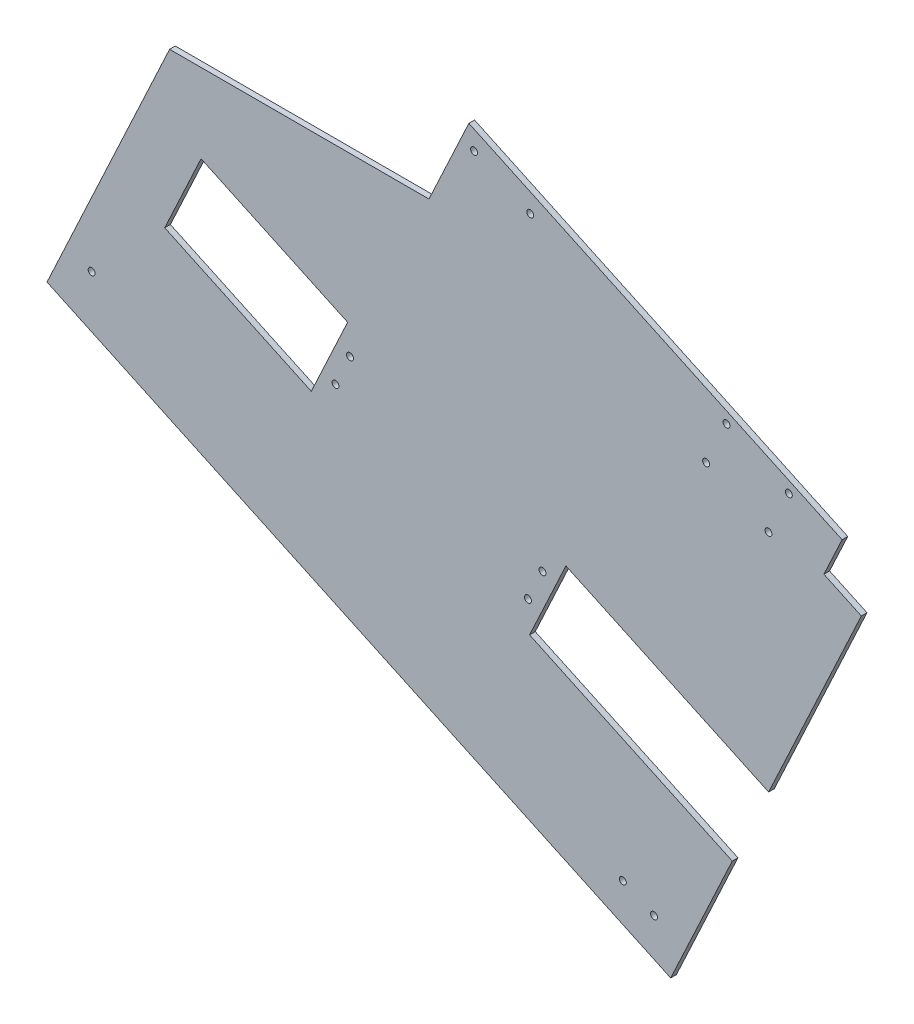
ISO-10303-21;
HEADER;
FILE_DESCRIPTION(('STEP AP214'),'2;1');
FILE_NAME('part.step','',(''),(''),'','','');
FILE_SCHEMA(('AUTOMOTIVE_DESIGN { 1 0 10303 214 1 1 1 1 }'));
ENDSEC;
DATA;
#1=APPLICATION_CONTEXT('core data for automotive mechanical design processes');
#2=APPLICATION_PROTOCOL_DEFINITION('international standard','automotive_design',2000,#1);
#3=PRODUCT_CONTEXT('',#1,'mechanical');
#4=PRODUCT('Part','Part','',(#3));
#5=PRODUCT_RELATED_PRODUCT_CATEGORY('part','',(#4));
#6=PRODUCT_DEFINITION_FORMATION('','',#4);
#7=PRODUCT_DEFINITION_CONTEXT('part definition',#1,'design');
#8=PRODUCT_DEFINITION('design','',#6,#7);
#9=PRODUCT_DEFINITION_SHAPE('','',#8);
#10=(LENGTH_UNIT() NAMED_UNIT(*) SI_UNIT(.MILLI.,.METRE.));
#11=(NAMED_UNIT(*) PLANE_ANGLE_UNIT() SI_UNIT($,.RADIAN.));
#12=(NAMED_UNIT(*) SI_UNIT($,.STERADIAN.) SOLID_ANGLE_UNIT());
#13=UNCERTAINTY_MEASURE_WITH_UNIT(LENGTH_MEASURE(1.E-05),#10,'distance_accuracy_value','');
#14=(GEOMETRIC_REPRESENTATION_CONTEXT(3) GLOBAL_UNCERTAINTY_ASSIGNED_CONTEXT((#13)) GLOBAL_UNIT_ASSIGNED_CONTEXT((#10,
#11,#12)) REPRESENTATION_CONTEXT('',''));
#15=CARTESIAN_POINT('',(0.,0.,0.));
#16=DIRECTION('',(0.,0.,1.));
#17=DIRECTION('',(1.,0.,0.));
#18=AXIS2_PLACEMENT_3D('',#15,#16,#17);
#19=CARTESIAN_POINT('',(140.969047692371,-84.2343516858792,605.067916458401));
#20=DIRECTION('',(-0.906307787036651,0.422618261740697,0.));
#21=DIRECTION('',(-0.422618261740697,-0.906307787036651,0.));
#22=AXIS2_PLACEMENT_3D('',#19,#20,#21);
#23=PLANE('',#22);
#24=DIRECTION('',(0.422618261740697,0.906307787036651,0.));
#25=VECTOR('',#24,1.);
#26=CARTESIAN_POINT('',(140.969047692371,-84.2343516858792,0.));
#27=LINE('',#26,#25);
#28=CARTESIAN_POINT('',(30.1585394639596,-321.86825344689,0.));
#29=VERTEX_POINT('',#28);
#30=CARTESIAN_POINT('',(65.9543062333968,-245.103983884885,0.));
#31=VERTEX_POINT('',#30);
#32=EDGE_CURVE('E232',#29,#31,#27,.T.);
#33=ORIENTED_EDGE('',*,*,#32,.T.);
#34=DIRECTION('',(0.,0.,1.));
#35=VECTOR('',#34,1.);
#36=CARTESIAN_POINT('',(65.9543062333968,-245.103983884885,-6.69999999999985));
#37=LINE('',#36,#35);
#38=CARTESIAN_POINT('',(65.9543062333968,-245.103983884885,3.30000000000015));
#39=VERTEX_POINT('',#38);
#40=EDGE_CURVE('E191',#31,#39,#37,.T.);
#41=ORIENTED_EDGE('',*,*,#40,.T.);
#42=DIRECTION('',(-0.422618261740697,-0.906307787036651,0.));
#43=VECTOR('',#42,1.);
#44=CARTESIAN_POINT('',(140.969047692371,-84.2343516858792,3.3000000000003));
#45=LINE('',#44,#43);
#46=CARTESIAN_POINT('',(30.1585394639596,-321.86825344689,3.30000000000031));
#47=VERTEX_POINT('',#46);
#48=EDGE_CURVE('E240',#39,#47,#45,.T.);
#49=ORIENTED_EDGE('',*,*,#48,.T.);
#50=DIRECTION('',(0.,0.,-1.));
#51=VECTOR('',#50,1.);
#52=CARTESIAN_POINT('',(30.1585394639596,-321.86825344689,605.067916458401));
#53=LINE('',#52,#51);
#54=EDGE_CURVE('E281',#47,#29,#53,.T.);
#55=ORIENTED_EDGE('',*,*,#54,.T.);
#56=EDGE_LOOP('',(#33,#41,#49,#55));
#57=FACE_BOUND('',#56,.T.);
#58=ADVANCED_FACE('F33',(#57),#23,.F.);
#59=CARTESIAN_POINT('',(0.,0.,0.));
#60=DIRECTION('',(0.,0.,-1.));
#61=DIRECTION('',(-1.,0.,0.));
#62=AXIS2_PLACEMENT_3D('',#59,#60,#61);
#63=PLANE('',#62);
#64=CARTESIAN_POINT('',(-52.7985285996815,-172.57110093474,0.));
#65=DIRECTION('',(0.,0.,-1.));
#66=DIRECTION('',(-1.,0.,0.));
#67=AXIS2_PLACEMENT_3D('',#64,#65,#66);
#68=CIRCLE('',#67,2.);
#69=CARTESIAN_POINT('',(-54.7985285996815,-172.57110093474,0.));
#70=VERTEX_POINT('',#69);
#71=EDGE_CURVE('E514',#70,#70,#68,.T.);
#72=ORIENTED_EDGE('',*,*,#71,.F.);
#73=EDGE_LOOP('',(#72));
#74=FACE_BOUND('',#73,.T.);
#75=CARTESIAN_POINT('',(-44.3461633648675,-154.444945194007,0.));
#76=DIRECTION('',(0.,0.,-1.));
#77=DIRECTION('',(-1.,0.,0.));
#78=AXIS2_PLACEMENT_3D('',#75,#76,#77);
#79=CIRCLE('',#78,2.);
#80=CARTESIAN_POINT('',(-46.3461633648675,-154.444945194007,0.));
#81=VERTEX_POINT('',#80);
#82=EDGE_CURVE('E511',#81,#81,#79,.T.);
#83=ORIENTED_EDGE('',*,*,#82,.F.);
#84=EDGE_LOOP('',(#83));
#85=FACE_BOUND('',#84,.T.);
#86=CARTESIAN_POINT('',(-164.672545808052,-120.403389961913,0.));
#87=DIRECTION('',(0.,0.,-1.));
#88=DIRECTION('',(-1.,0.,0.));
#89=AXIS2_PLACEMENT_3D('',#86,#87,#88);
#90=CIRCLE('',#89,1.99999999999997);
#91=CARTESIAN_POINT('',(-166.672545808052,-120.403389961913,0.));
#92=VERTEX_POINT('',#91);
#93=EDGE_CURVE('E508',#92,#92,#90,.T.);
#94=ORIENTED_EDGE('',*,*,#93,.F.);
#95=EDGE_LOOP('',(#94));
#96=FACE_BOUND('',#95,.T.);
#97=CARTESIAN_POINT('',(-156.220180573238,-102.27723422118,0.));
#98=DIRECTION('',(0.,0.,-1.));
#99=DIRECTION('',(-1.,0.,0.));
#100=AXIS2_PLACEMENT_3D('',#97,#98,#99);
#101=CIRCLE('',#100,2.);
#102=CARTESIAN_POINT('',(-158.220180573238,-102.27723422118,0.));
#103=VERTEX_POINT('',#102);
#104=EDGE_CURVE('E505',#103,#103,#101,.T.);
#105=ORIENTED_EDGE('',*,*,#104,.F.);
#106=EDGE_LOOP('',(#105));
#107=FACE_BOUND('',#106,.T.);
#108=DIRECTION('',(-0.906307787036651,0.422618261740697,0.));
#109=VECTOR('',#108,1.);
#110=CARTESIAN_POINT('',(-82.1004247301206,-176.064929010519,0.));
#111=LINE('',#110,#109);
#112=CARTESIAN_POINT('',(-178.748796266499,-130.997053214897,0.));
#113=VERTEX_POINT('',#112);
#114=CARTESIAN_POINT('',(-263.941728247944,-91.2709366112713,0.));
#115=VERTEX_POINT('',#114);
#116=EDGE_CURVE('E180',#113,#115,#111,.T.);
#117=ORIENTED_EDGE('',*,*,#116,.F.);
#118=DIRECTION('',(-0.422618261740696,-0.906307787036651,0.));
#119=VECTOR('',#118,1.);
#120=CARTESIAN_POINT('',(-96.6483715363787,45.0678757956226,0.));
#121=LINE('',#120,#119);
#122=CARTESIAN_POINT('',(-157.617883179464,-85.6816638630641,0.));
#123=VERTEX_POINT('',#122);
#124=EDGE_CURVE('E173',#123,#113,#121,.T.);
#125=ORIENTED_EDGE('',*,*,#124,.F.);
#126=DIRECTION('',(0.906307787036651,-0.422618261740696,0.));
#127=VECTOR('',#126,1.);
#128=CARTESIAN_POINT('',(-60.9695116430858,-130.749539658687,0.));
#129=LINE('',#128,#127);
#130=CARTESIAN_POINT('',(-242.810815160909,-45.9555472594389,0.));
#131=VERTEX_POINT('',#130);
#132=EDGE_CURVE('E154',#131,#123,#129,.T.);
#133=ORIENTED_EDGE('',*,*,#132,.F.);
#134=DIRECTION('',(0.422618261740697,0.906307787036651,0.));
#135=VECTOR('',#134,1.);
#136=CARTESIAN_POINT('',(-181.841303517823,84.7939923992478,0.));
#137=LINE('',#136,#135);
#138=EDGE_CURVE('E178',#115,#131,#137,.T.);
#139=ORIENTED_EDGE('',*,*,#138,.F.);
#140=EDGE_LOOP('',(#117,#125,#133,#139));
#141=FACE_BOUND('',#140,.T.);
#142=DIRECTION('',(-0.906307787036651,0.422618261740697,0.));
#143=VECTOR('',#142,1.);
#144=CARTESIAN_POINT('',(-82.1004247301206,-176.064929010519,0.));
#145=LINE('',#144,#143);
#146=CARTESIAN_POINT('',(-51.8657060813679,-190.163609858594,0.));
#147=VERTEX_POINT('',#146);
#148=EDGE_CURVE('E203',#31,#147,#145,.T.);
#149=ORIENTED_EDGE('',*,*,#148,.F.);
#150=ORIENTED_EDGE('',*,*,#32,.F.);
#151=DIRECTION('',(0.906307787036651,-0.422618261740697,0.));
#152=VECTOR('',#151,1.);
#153=CARTESIAN_POINT('',(30.1585394639596,-321.86825344689,0.));
#154=LINE('',#153,#152);
#155=CARTESIAN_POINT('',(-332.364575350701,-152.820948750611,0.));
#156=VERTEX_POINT('',#155);
#157=EDGE_CURVE('E237',#156,#29,#154,.T.);
#158=ORIENTED_EDGE('',*,*,#157,.F.);
#159=DIRECTION('',(-0.422618261740698,-0.906307787036651,0.));
#160=VECTOR('',#159,1.);
#161=CARTESIAN_POINT('',(-332.364575350701,-152.820948750611,0.));
#162=LINE('',#161,#160);
#163=CARTESIAN_POINT('',(-261.101380083713,0.00346667706951484,0.));
#164=VERTEX_POINT('',#163);
#165=EDGE_CURVE('E242',#164,#156,#162,.T.);
#166=ORIENTED_EDGE('',*,*,#165,.F.);
#167=DIRECTION('',(-1.,0.,0.));
#168=VECTOR('',#167,1.);
#169=CARTESIAN_POINT('',(-261.101380083713,0.00346667706951484,0.));
#170=LINE('',#169,#168);
#171=CARTESIAN_POINT('',(-110.332441908566,0.00346667706951484,0.));
#172=VERTEX_POINT('',#171);
#173=EDGE_CURVE('E247',#172,#164,#170,.T.);
#174=ORIENTED_EDGE('',*,*,#173,.F.);
#175=DIRECTION('',(-0.422618261740696,-0.906307787036651,0.));
#176=VECTOR('',#175,1.);
#177=CARTESIAN_POINT('',(-110.332441908566,0.00346667706951484,0.));
#178=LINE('',#177,#176);
#179=CARTESIAN_POINT('',(-87.1479387989079,49.7227940443066,0.));
#180=VERTEX_POINT('',#179);
#181=EDGE_CURVE('E252',#180,#172,#178,.T.);
#182=ORIENTED_EDGE('',*,*,#181,.F.);
#183=DIRECTION('',(-0.906307787036651,0.422618261740696,0.));
#184=VECTOR('',#183,1.);
#185=CARTESIAN_POINT('',(-87.1479387989079,49.7227940443066,0.));
#186=LINE('',#185,#184);
#187=CARTESIAN_POINT('',(129.783117347009,-51.4338187281854,0.));
#188=VERTEX_POINT('',#187);
#189=EDGE_CURVE('E218',#188,#180,#186,.T.);
#190=ORIENTED_EDGE('',*,*,#189,.F.);
#191=DIRECTION('',(0.422618261740695,0.906307787036652,0.));
#192=VECTOR('',#191,1.);
#193=CARTESIAN_POINT('',(129.783117347009,-51.4338187281854,0.));
#194=LINE('',#193,#192);
#195=CARTESIAN_POINT('',(119.217660803491,-74.0915134041025,0.));
#196=VERTEX_POINT('',#195);
#197=EDGE_CURVE('E222',#196,#188,#194,.T.);
#198=ORIENTED_EDGE('',*,*,#197,.F.);
#199=DIRECTION('',(-0.906307787036651,0.422618261740697,0.));
#200=VECTOR('',#199,1.);
#201=CARTESIAN_POINT('',(119.217660803491,-74.0915134041025,0.));
#202=LINE('',#201,#200);
#203=CARTESIAN_POINT('',(140.969047692371,-84.2343516858792,0.));
#204=VERTEX_POINT('',#203);
#205=EDGE_CURVE('E227',#204,#196,#202,.T.);
#206=ORIENTED_EDGE('',*,*,#205,.F.);
#207=CARTESIAN_POINT('',(87.0852193204317,-199.788594533052,0.));
#208=VERTEX_POINT('',#207);
#209=EDGE_CURVE('E236',#208,#204,#27,.T.);
#210=ORIENTED_EDGE('',*,*,#209,.F.);
#211=DIRECTION('',(0.906307787036652,-0.422618261740696,0.));
#212=VECTOR('',#211,1.);
#213=CARTESIAN_POINT('',(-60.9695116430857,-130.749539658687,0.));
#214=LINE('',#213,#212);
#215=CARTESIAN_POINT('',(-30.7347929943331,-144.848220506762,0.));
#216=VERTEX_POINT('',#215);
#217=EDGE_CURVE('E194',#216,#208,#214,.T.);
#218=ORIENTED_EDGE('',*,*,#217,.F.);
#219=DIRECTION('',(0.422618261740696,0.906307787036652,0.));
#220=VECTOR('',#219,1.);
#221=CARTESIAN_POINT('',(30.2347186487526,-14.098680848075,0.));
#222=LINE('',#221,#220);
#223=EDGE_CURVE('E201',#147,#216,#222,.T.);
#224=ORIENTED_EDGE('',*,*,#223,.F.);
#225=EDGE_LOOP('',(#149,#150,#158,#166,#174,#182,#190,#198,#206,#210,#218,#224));
#226=FACE_BOUND('',#225,.T.);
#227=CARTESIAN_POINT('',(-51.4965787867016,22.0645126573495,0.));
#228=DIRECTION('',(0.,0.,-1.));
#229=DIRECTION('',(-1.,0.,0.));
#230=AXIS2_PLACEMENT_3D('',#227,#228,#229);
#231=CIRCLE('',#230,2.);
#232=CARTESIAN_POINT('',(-53.4965787867016,22.0645126573495,0.));
#233=VERTEX_POINT('',#232);
#234=EDGE_CURVE('E210',#233,#233,#231,.T.);
#235=ORIENTED_EDGE('',*,*,#234,.F.);
#236=EDGE_LOOP('',(#235));
#237=FACE_BOUND('',#236,.T.);
#238=CARTESIAN_POINT('',(-84.123659120021,37.2787700800146,0.));
#239=DIRECTION('',(0.,0.,-1.));
#240=DIRECTION('',(-1.,0.,0.));
#241=AXIS2_PLACEMENT_3D('',#238,#239,#240);
#242=CIRCLE('',#241,2.00000000000001);
#243=CARTESIAN_POINT('',(-86.1236591200211,37.2787700800146,0.));
#244=VERTEX_POINT('',#243);
#245=EDGE_CURVE('E205',#244,#244,#242,.T.);
#246=ORIENTED_EDGE('',*,*,#245,.F.);
#247=EDGE_LOOP('',(#246));
#248=FACE_BOUND('',#247,.T.);
#249=CARTESIAN_POINT('',(2.35859321730739,-286.837367236529,0.));
#250=DIRECTION('',(0.,0.,1.));
#251=DIRECTION('',(1.,0.,0.));
#252=AXIS2_PLACEMENT_3D('',#249,#250,#251);
#253=CIRCLE('',#252,2.);
#254=CARTESIAN_POINT('',(4.35859321730739,-286.837367236529,0.));
#255=VERTEX_POINT('',#254);
#256=EDGE_CURVE('E209',#255,#255,#253,.T.);
#257=ORIENTED_EDGE('',*,*,#256,.T.);
#258=EDGE_LOOP('',(#257));
#259=FACE_BOUND('',#258,.T.);
#260=CARTESIAN_POINT('',(50.7512369685833,-52.0954969140643,0.));
#261=DIRECTION('',(0.,0.,1.));
#262=DIRECTION('',(1.,0.,0.));
#263=AXIS2_PLACEMENT_3D('',#260,#261,#262);
#264=CIRCLE('',#263,2.);
#265=CARTESIAN_POINT('',(52.7512369685833,-52.0954969140643,0.));
#266=VERTEX_POINT('',#265);
#267=EDGE_CURVE('E264',#266,#266,#264,.T.);
#268=ORIENTED_EDGE('',*,*,#267,.T.);
#269=EDGE_LOOP('',(#268));
#270=FACE_BOUND('',#269,.T.);
#271=CARTESIAN_POINT('',(98.8368597787888,-43.623609346666,0.));
#272=DIRECTION('',(0.,0.,1.));
#273=DIRECTION('',(1.,0.,0.));
#274=AXIS2_PLACEMENT_3D('',#271,#272,#273);
#275=CIRCLE('',#274,2.);
#276=CARTESIAN_POINT('',(100.836859778789,-43.623609346666,0.));
#277=VERTEX_POINT('',#276);
#278=EDGE_CURVE('E261',#277,#277,#275,.T.);
#279=ORIENTED_EDGE('',*,*,#278,.T.);
#280=EDGE_LOOP('',(#279));
#281=FACE_BOUND('',#280,.T.);
#282=CARTESIAN_POINT('',(87.0035484500493,-69.0002273836922,0.));
#283=DIRECTION('',(0.,0.,1.));
#284=DIRECTION('',(1.,0.,0.));
#285=AXIS2_PLACEMENT_3D('',#282,#283,#284);
#286=CIRCLE('',#285,2.);
#287=CARTESIAN_POINT('',(89.0035484500493,-69.0002273836922,0.));
#288=VERTEX_POINT('',#287);
#289=EDGE_CURVE('E257',#288,#288,#286,.T.);
#290=ORIENTED_EDGE('',*,*,#289,.T.);
#291=EDGE_LOOP('',(#290));
#292=FACE_BOUND('',#291,.T.);
#293=CARTESIAN_POINT('',(62.5845482973228,-26.7188788770381,0.));
#294=DIRECTION('',(0.,0.,1.));
#295=DIRECTION('',(1.,0.,0.));
#296=AXIS2_PLACEMENT_3D('',#293,#294,#295);
#297=CIRCLE('',#296,2.);
#298=CARTESIAN_POINT('',(64.5845482973228,-26.7188788770381,0.));
#299=VERTEX_POINT('',#298);
#300=EDGE_CURVE('E260',#299,#299,#297,.T.);
#301=ORIENTED_EDGE('',*,*,#300,.T.);
#302=EDGE_LOOP('',(#301));
#303=FACE_BOUND('',#302,.T.);
#304=CARTESIAN_POINT('',(-306.422910117653,-134.574853142606,0.));
#305=DIRECTION('',(0.,0.,1.));
#306=DIRECTION('',(1.,0.,0.));
#307=AXIS2_PLACEMENT_3D('',#304,#305,#306);
#308=CIRCLE('',#307,2.);
#309=CARTESIAN_POINT('',(-304.422910117653,-134.574853142606,0.));
#310=VERTEX_POINT('',#309);
#311=EDGE_CURVE('E267',#310,#310,#308,.T.);
#312=ORIENTED_EDGE('',*,*,#311,.T.);
#313=EDGE_LOOP('',(#312));
#314=FACE_BOUND('',#313,.T.);
#315=CARTESIAN_POINT('',(20.4847489580404,-295.289732471343,0.));
#316=DIRECTION('',(0.,0.,1.));
#317=DIRECTION('',(1.,0.,0.));
#318=AXIS2_PLACEMENT_3D('',#315,#316,#317);
#319=CIRCLE('',#318,2.);
#320=CARTESIAN_POINT('',(22.4847489580404,-295.289732471343,0.));
#321=VERTEX_POINT('',#320);
#322=EDGE_CURVE('E272',#321,#321,#319,.T.);
#323=ORIENTED_EDGE('',*,*,#322,.T.);
#324=EDGE_LOOP('',(#323));
#325=FACE_BOUND('',#324,.T.);
#326=ADVANCED_FACE('F329',(#74,#85,#96,#107,#141,#226,#237,#248,#259,#270,#281,#292,#303,#314,
#325),#63,.T.);
#327=CARTESIAN_POINT('',(-110.332441908566,0.00346667706951484,605.067916458401));
#328=DIRECTION('',(0.906307787036651,-0.422618261740696,0.));
#329=DIRECTION('',(0.422618261740696,0.906307787036651,0.));
#330=AXIS2_PLACEMENT_3D('',#327,#328,#329);
#331=PLANE('',#330);
#332=DIRECTION('',(0.,0.,-1.));
#333=VECTOR('',#332,1.);
#334=CARTESIAN_POINT('',(-110.332441908566,0.00346667706951484,605.067916458401));
#335=LINE('',#334,#333);
#336=CARTESIAN_POINT('',(-110.332441908566,0.00346667706951484,3.30000000000009));
#337=VERTEX_POINT('',#336);
#338=EDGE_CURVE('E251',#337,#172,#335,.T.);
#339=ORIENTED_EDGE('',*,*,#338,.F.);
#340=DIRECTION('',(0.422618261740696,0.906307787036651,0.));
#341=VECTOR('',#340,1.);
#342=CARTESIAN_POINT('',(-110.332441908566,0.00346667706949761,3.30000000000008));
#343=LINE('',#342,#341);
#344=CARTESIAN_POINT('',(-87.1479387989079,49.7227940443066,3.30000000000008));
#345=VERTEX_POINT('',#344);
#346=EDGE_CURVE('E277',#337,#345,#343,.T.);
#347=ORIENTED_EDGE('',*,*,#346,.T.);
#348=DIRECTION('',(0.,0.,-1.));
#349=VECTOR('',#348,1.);
#350=CARTESIAN_POINT('',(-87.1479387989079,49.7227940443066,605.067916458401));
#351=LINE('',#350,#349);
#352=EDGE_CURVE('E256',#345,#180,#351,.T.);
#353=ORIENTED_EDGE('',*,*,#352,.T.);
#354=ORIENTED_EDGE('',*,*,#181,.T.);
#355=EDGE_LOOP('',(#339,#347,#353,#354));
#356=FACE_BOUND('',#355,.T.);
#357=ADVANCED_FACE('F331',(#356),#331,.F.);
#358=CARTESIAN_POINT('',(-261.101380083713,0.00346667706951484,605.067916458401));
#359=DIRECTION('',(0.,-1.,0.));
#360=DIRECTION('',(0.,0.,-1.));
#361=AXIS2_PLACEMENT_3D('',#358,#359,#360);
#362=PLANE('',#361);
#363=DIRECTION('',(0.,0.,-1.));
#364=VECTOR('',#363,1.);
#365=CARTESIAN_POINT('',(-261.101380083713,0.00346667706951484,605.067916458401));
#366=LINE('',#365,#364);
#367=CARTESIAN_POINT('',(-261.101380083713,0.00346667706951909,3.29999999999996));
#368=VERTEX_POINT('',#367);
#369=EDGE_CURVE('E246',#368,#164,#366,.T.);
#370=ORIENTED_EDGE('',*,*,#369,.F.);
#371=DIRECTION('',(1.,0.,0.));
#372=VECTOR('',#371,1.);
#373=CARTESIAN_POINT('',(-261.101380083713,0.00346667706951484,3.29999999999997));
#374=LINE('',#373,#372);
#375=EDGE_CURVE('E255',#368,#337,#374,.T.);
#376=ORIENTED_EDGE('',*,*,#375,.T.);
#377=ORIENTED_EDGE('',*,*,#338,.T.);
#378=ORIENTED_EDGE('',*,*,#173,.T.);
#379=EDGE_LOOP('',(#370,#376,#377,#378));
#380=FACE_BOUND('',#379,.T.);
#381=ADVANCED_FACE('F338',(#380),#362,.F.);
#382=CARTESIAN_POINT('',(-332.364575350701,-152.820948750611,605.067916458401));
#383=DIRECTION('',(0.906307787036651,-0.422618261740698,0.));
#384=DIRECTION('',(0.422618261740698,0.906307787036651,0.));
#385=AXIS2_PLACEMENT_3D('',#382,#383,#384);
#386=PLANE('',#385);
#387=DIRECTION('',(0.,0.,-1.));
#388=VECTOR('',#387,1.);
#389=CARTESIAN_POINT('',(-332.364575350701,-152.820948750611,605.067916458401));
#390=LINE('',#389,#388);
#391=CARTESIAN_POINT('',(-332.364575350701,-152.820948750611,3.29999999999995));
#392=VERTEX_POINT('',#391);
#393=EDGE_CURVE('E241',#392,#156,#390,.T.);
#394=ORIENTED_EDGE('',*,*,#393,.F.);
#395=DIRECTION('',(0.422618261740698,0.906307787036651,0.));
#396=VECTOR('',#395,1.);
#397=CARTESIAN_POINT('',(-332.364575350701,-152.820948750611,3.29999999999997));
#398=LINE('',#397,#396);
#399=EDGE_CURVE('E250',#392,#368,#398,.T.);
#400=ORIENTED_EDGE('',*,*,#399,.T.);
#401=ORIENTED_EDGE('',*,*,#369,.T.);
#402=ORIENTED_EDGE('',*,*,#165,.T.);
#403=EDGE_LOOP('',(#394,#400,#401,#402));
#404=FACE_BOUND('',#403,.T.);
#405=ADVANCED_FACE('F390',(#404),#386,.F.);
#406=CARTESIAN_POINT('',(30.1585394639596,-321.86825344689,605.067916458401));
#407=DIRECTION('',(0.422618261740697,0.906307787036651,0.));
#408=DIRECTION('',(-0.906307787036651,0.422618261740697,0.));
#409=AXIS2_PLACEMENT_3D('',#406,#407,#408);
#410=PLANE('',#409);
#411=ORIENTED_EDGE('',*,*,#54,.F.);
#412=DIRECTION('',(-0.906307787036651,0.422618261740697,0.));
#413=VECTOR('',#412,1.);
#414=CARTESIAN_POINT('',(30.15853946396,-321.86825344689,3.3000000000003));
#415=LINE('',#414,#413);
#416=EDGE_CURVE('E245',#47,#392,#415,.T.);
#417=ORIENTED_EDGE('',*,*,#416,.T.);
#418=ORIENTED_EDGE('',*,*,#393,.T.);
#419=ORIENTED_EDGE('',*,*,#157,.T.);
#420=EDGE_LOOP('',(#411,#417,#418,#419));
#421=FACE_BOUND('',#420,.T.);
#422=ADVANCED_FACE('F386',(#421),#410,.F.);
#423=CARTESIAN_POINT('',(140.969047692371,-84.2343516858791,3.30000000000032));
#424=VERTEX_POINT('',#423);
#425=CARTESIAN_POINT('',(87.0852193204317,-199.788594533052,3.3000000000003));
#426=VERTEX_POINT('',#425);
#427=EDGE_CURVE('E283',#424,#426,#45,.T.);
#428=ORIENTED_EDGE('',*,*,#427,.T.);
#429=DIRECTION('',(0.,0.,1.));
#430=VECTOR('',#429,1.);
#431=CARTESIAN_POINT('',(87.0852193204317,-199.788594533052,-6.69999999999985));
#432=LINE('',#431,#430);
#433=EDGE_CURVE('E190',#208,#426,#432,.T.);
#434=ORIENTED_EDGE('',*,*,#433,.F.);
#435=ORIENTED_EDGE('',*,*,#209,.T.);
#436=DIRECTION('',(0.,0.,-1.));
#437=VECTOR('',#436,1.);
#438=CARTESIAN_POINT('',(140.969047692371,-84.2343516858792,605.067916458401));
#439=LINE('',#438,#437);
#440=EDGE_CURVE('E231',#424,#204,#439,.T.);
#441=ORIENTED_EDGE('',*,*,#440,.F.);
#442=EDGE_LOOP('',(#428,#434,#435,#441));
#443=FACE_BOUND('',#442,.T.);
#444=ADVANCED_FACE('F343',(#443),#23,.F.);
#445=CARTESIAN_POINT('',(119.217660803491,-74.0915134041025,605.067916458401));
#446=DIRECTION('',(-0.422618261740697,-0.906307787036651,0.));
#447=DIRECTION('',(0.906307787036651,-0.422618261740697,0.));
#448=AXIS2_PLACEMENT_3D('',#445,#446,#447);
#449=PLANE('',#448);
#450=DIRECTION('',(0.,0.,-1.));
#451=VECTOR('',#450,1.);
#452=CARTESIAN_POINT('',(119.217660803491,-74.0915134041025,605.067916458401));
#453=LINE('',#452,#451);
#454=CARTESIAN_POINT('',(119.217660803491,-74.0915134041025,3.3000000000003));
#455=VERTEX_POINT('',#454);
#456=EDGE_CURVE('E226',#455,#196,#453,.T.);
#457=ORIENTED_EDGE('',*,*,#456,.F.);
#458=DIRECTION('',(0.906307787036651,-0.422618261740697,0.));
#459=VECTOR('',#458,1.);
#460=CARTESIAN_POINT('',(119.217660803491,-74.0915134041027,3.3000000000003));
#461=LINE('',#460,#459);
#462=EDGE_CURVE('E235',#455,#424,#461,.T.);
#463=ORIENTED_EDGE('',*,*,#462,.T.);
#464=ORIENTED_EDGE('',*,*,#440,.T.);
#465=ORIENTED_EDGE('',*,*,#205,.T.);
#466=EDGE_LOOP('',(#457,#463,#464,#465));
#467=FACE_BOUND('',#466,.T.);
#468=ADVANCED_FACE('F380',(#467),#449,.F.);
#469=CARTESIAN_POINT('',(129.783117347009,-51.4338187281854,605.067916458401));
#470=DIRECTION('',(-0.906307787036652,0.422618261740695,0.));
#471=DIRECTION('',(-0.422618261740695,-0.906307787036652,0.));
#472=AXIS2_PLACEMENT_3D('',#469,#470,#471);
#473=PLANE('',#472);
#474=DIRECTION('',(0.,0.,-1.));
#475=VECTOR('',#474,1.);
#476=CARTESIAN_POINT('',(129.783117347009,-51.4338187281854,605.067916458401));
#477=LINE('',#476,#475);
#478=CARTESIAN_POINT('',(129.783117347009,-51.4338187281854,3.30000000000019));
#479=VERTEX_POINT('',#478);
#480=EDGE_CURVE('E221',#479,#188,#477,.T.);
#481=ORIENTED_EDGE('',*,*,#480,.F.);
#482=DIRECTION('',(-0.422618261740695,-0.906307787036652,0.));
#483=VECTOR('',#482,1.);
#484=CARTESIAN_POINT('',(129.783117347009,-51.4338187281855,3.3000000000003));
#485=LINE('',#484,#483);
#486=EDGE_CURVE('E230',#479,#455,#485,.T.);
#487=ORIENTED_EDGE('',*,*,#486,.T.);
#488=ORIENTED_EDGE('',*,*,#456,.T.);
#489=ORIENTED_EDGE('',*,*,#197,.T.);
#490=EDGE_LOOP('',(#481,#487,#488,#489));
#491=FACE_BOUND('',#490,.T.);
#492=ADVANCED_FACE('F376',(#491),#473,.F.);
#493=CARTESIAN_POINT('',(-87.1479387989079,49.7227940443066,605.067916458401));
#494=DIRECTION('',(-0.422618261740697,-0.906307787036651,0.));
#495=DIRECTION('',(0.906307787036651,-0.422618261740697,0.));
#496=AXIS2_PLACEMENT_3D('',#493,#494,#495);
#497=PLANE('',#496);
#498=ORIENTED_EDGE('',*,*,#352,.F.);
#499=DIRECTION('',(0.906307787036651,-0.422618261740697,0.));
#500=VECTOR('',#499,1.);
#501=CARTESIAN_POINT('',(-87.1479387989074,49.7227940443063,3.30000000000008));
#502=LINE('',#501,#500);
#503=EDGE_CURVE('E225',#345,#479,#502,.T.);
#504=ORIENTED_EDGE('',*,*,#503,.T.);
#505=ORIENTED_EDGE('',*,*,#480,.T.);
#506=ORIENTED_EDGE('',*,*,#189,.T.);
#507=EDGE_LOOP('',(#498,#504,#505,#506));
#508=FACE_BOUND('',#507,.T.);
#509=ADVANCED_FACE('F372',(#508),#497,.F.);
#510=CARTESIAN_POINT('',(87.0035484500493,-69.0002273836922,605.067916458401));
#511=DIRECTION('',(0.,0.,-1.));
#512=DIRECTION('',(-1.,0.,0.));
#513=AXIS2_PLACEMENT_3D('',#510,#511,#512);
#514=CYLINDRICAL_SURFACE('',#513,2.);
#515=CARTESIAN_POINT('',(87.0035484500493,-69.0002273836922,3.3000000000003));
#516=DIRECTION('',(0.,0.,-1.));
#517=DIRECTION('',(-1.,0.,0.));
#518=AXIS2_PLACEMENT_3D('',#515,#516,#517);
#519=CIRCLE('',#518,2.);
#520=CARTESIAN_POINT('',(85.0035484500493,-69.0002273836922,3.3000000000003));
#521=VERTEX_POINT('',#520);
#522=EDGE_CURVE('E11',#521,#521,#519,.T.);
#523=ORIENTED_EDGE('',*,*,#522,.F.);
#524=EDGE_LOOP('',(#523));
#525=FACE_BOUND('',#524,.T.);
#526=ORIENTED_EDGE('',*,*,#289,.F.);
#527=EDGE_LOOP('',(#526));
#528=FACE_BOUND('',#527,.T.);
#529=ADVANCED_FACE('F368',(#525,#528),#514,.F.);
#530=CARTESIAN_POINT('',(98.8368597787888,-43.623609346666,605.067916458401));
#531=DIRECTION('',(0.,0.,-1.));
#532=DIRECTION('',(-1.,0.,0.));
#533=AXIS2_PLACEMENT_3D('',#530,#531,#532);
#534=CYLINDRICAL_SURFACE('',#533,2.);
#535=CARTESIAN_POINT('',(98.8368597787888,-43.623609346666,3.3000000000003));
#536=DIRECTION('',(0.,0.,-1.));
#537=DIRECTION('',(-1.,0.,0.));
#538=AXIS2_PLACEMENT_3D('',#535,#536,#537);
#539=CIRCLE('',#538,2.);
#540=CARTESIAN_POINT('',(96.8368597787888,-43.623609346666,3.3000000000003));
#541=VERTEX_POINT('',#540);
#542=EDGE_CURVE('E42',#541,#541,#539,.T.);
#543=ORIENTED_EDGE('',*,*,#542,.F.);
#544=EDGE_LOOP('',(#543));
#545=FACE_BOUND('',#544,.T.);
#546=ORIENTED_EDGE('',*,*,#278,.F.);
#547=EDGE_LOOP('',(#546));
#548=FACE_BOUND('',#547,.T.);
#549=ADVANCED_FACE('F364',(#545,#548),#534,.F.);
#550=CARTESIAN_POINT('',(62.5845482973228,-26.7188788770381,605.067916458401));
#551=DIRECTION('',(0.,0.,-1.));
#552=DIRECTION('',(-1.,0.,0.));
#553=AXIS2_PLACEMENT_3D('',#550,#551,#552);
#554=CYLINDRICAL_SURFACE('',#553,2.);
#555=CARTESIAN_POINT('',(62.5845482973228,-26.7188788770381,3.3000000000003));
#556=DIRECTION('',(0.,0.,-1.));
#557=DIRECTION('',(-1.,0.,0.));
#558=AXIS2_PLACEMENT_3D('',#555,#556,#557);
#559=CIRCLE('',#558,2.);
#560=CARTESIAN_POINT('',(60.5845482973228,-26.7188788770381,3.3000000000003));
#561=VERTEX_POINT('',#560);
#562=EDGE_CURVE('E307',#561,#561,#559,.T.);
#563=ORIENTED_EDGE('',*,*,#562,.F.);
#564=EDGE_LOOP('',(#563));
#565=FACE_BOUND('',#564,.T.);
#566=ORIENTED_EDGE('',*,*,#300,.F.);
#567=EDGE_LOOP('',(#566));
#568=FACE_BOUND('',#567,.T.);
#569=ADVANCED_FACE('F360',(#565,#568),#554,.F.);
#570=CARTESIAN_POINT('',(50.7512369685833,-52.0954969140643,605.067916458401));
#571=DIRECTION('',(0.,0.,-1.));
#572=DIRECTION('',(-1.,0.,0.));
#573=AXIS2_PLACEMENT_3D('',#570,#571,#572);
#574=CYLINDRICAL_SURFACE('',#573,2.);
#575=CARTESIAN_POINT('',(50.7512369685833,-52.0954969140643,3.3000000000003));
#576=DIRECTION('',(0.,0.,-1.));
#577=DIRECTION('',(-1.,0.,0.));
#578=AXIS2_PLACEMENT_3D('',#575,#576,#577);
#579=CIRCLE('',#578,2.);
#580=CARTESIAN_POINT('',(48.7512369685833,-52.0954969140643,3.3000000000003));
#581=VERTEX_POINT('',#580);
#582=EDGE_CURVE('E310',#581,#581,#579,.T.);
#583=ORIENTED_EDGE('',*,*,#582,.F.);
#584=EDGE_LOOP('',(#583));
#585=FACE_BOUND('',#584,.T.);
#586=ORIENTED_EDGE('',*,*,#267,.F.);
#587=EDGE_LOOP('',(#586));
#588=FACE_BOUND('',#587,.T.);
#589=ADVANCED_FACE('F356',(#585,#588),#574,.F.);
#590=CARTESIAN_POINT('',(-306.422910117653,-134.574853142606,605.067916458401));
#591=DIRECTION('',(0.,0.,-1.));
#592=DIRECTION('',(-1.,0.,0.));
#593=AXIS2_PLACEMENT_3D('',#590,#591,#592);
#594=CYLINDRICAL_SURFACE('',#593,2.);
#595=CARTESIAN_POINT('',(-306.422910117653,-134.574853142606,3.29999999999997));
#596=DIRECTION('',(0.,0.,-1.));
#597=DIRECTION('',(-1.,0.,0.));
#598=AXIS2_PLACEMENT_3D('',#595,#596,#597);
#599=CIRCLE('',#598,2.);
#600=CARTESIAN_POINT('',(-308.422910117653,-134.574853142606,3.29999999999997));
#601=VERTEX_POINT('',#600);
#602=EDGE_CURVE('E313',#601,#601,#599,.T.);
#603=ORIENTED_EDGE('',*,*,#602,.F.);
#604=EDGE_LOOP('',(#603));
#605=FACE_BOUND('',#604,.T.);
#606=ORIENTED_EDGE('',*,*,#311,.F.);
#607=EDGE_LOOP('',(#606));
#608=FACE_BOUND('',#607,.T.);
#609=ADVANCED_FACE('F352',(#605,#608),#594,.F.);
#610=CARTESIAN_POINT('',(2.35859321730739,-286.837367236529,605.067916458401));
#611=DIRECTION('',(0.,0.,-1.));
#612=DIRECTION('',(-1.,0.,0.));
#613=AXIS2_PLACEMENT_3D('',#610,#611,#612);
#614=CYLINDRICAL_SURFACE('',#613,2.);
#615=CARTESIAN_POINT('',(2.35859321730739,-286.837367236529,3.3000000000003));
#616=DIRECTION('',(0.,0.,-1.));
#617=DIRECTION('',(-1.,0.,0.));
#618=AXIS2_PLACEMENT_3D('',#615,#616,#617);
#619=CIRCLE('',#618,2.);
#620=CARTESIAN_POINT('',(0.358593217307385,-286.837367236529,3.3000000000003));
#621=VERTEX_POINT('',#620);
#622=EDGE_CURVE('E315',#621,#621,#619,.T.);
#623=ORIENTED_EDGE('',*,*,#622,.F.);
#624=EDGE_LOOP('',(#623));
#625=FACE_BOUND('',#624,.T.);
#626=ORIENTED_EDGE('',*,*,#256,.F.);
#627=EDGE_LOOP('',(#626));
#628=FACE_BOUND('',#627,.T.);
#629=ADVANCED_FACE('F326',(#625,#628),#614,.F.);
#630=CARTESIAN_POINT('',(20.4847489580404,-295.289732471343,605.067916458401));
#631=DIRECTION('',(0.,0.,-1.));
#632=DIRECTION('',(-1.,0.,0.));
#633=AXIS2_PLACEMENT_3D('',#630,#631,#632);
#634=CYLINDRICAL_SURFACE('',#633,2.);
#635=CARTESIAN_POINT('',(20.4847489580404,-295.289732471343,3.3000000000003));
#636=DIRECTION('',(0.,0.,-1.));
#637=DIRECTION('',(-1.,0.,0.));
#638=AXIS2_PLACEMENT_3D('',#635,#636,#637);
#639=CIRCLE('',#638,2.);
#640=CARTESIAN_POINT('',(18.4847489580404,-295.289732471343,3.3000000000003));
#641=VERTEX_POINT('',#640);
#642=EDGE_CURVE('E37',#641,#641,#639,.T.);
#643=ORIENTED_EDGE('',*,*,#642,.F.);
#644=EDGE_LOOP('',(#643));
#645=FACE_BOUND('',#644,.T.);
#646=ORIENTED_EDGE('',*,*,#322,.F.);
#647=EDGE_LOOP('',(#646));
#648=FACE_BOUND('',#647,.T.);
#649=ADVANCED_FACE('F323',(#645,#648),#634,.F.);
#650=CARTESIAN_POINT('',(111.163748546422,-29.8419428145985,3.30000000000025));
#651=DIRECTION('',(0.,0.,-1.));
#652=DIRECTION('',(-0.906307787036651,0.422618261740697,0.));
#653=AXIS2_PLACEMENT_3D('',#650,#651,#652);
#654=PLANE('',#653);
#655=CARTESIAN_POINT('',(-52.7985285996815,-172.57110093474,3.30000000000015));
#656=DIRECTION('',(0.,0.,1.));
#657=DIRECTION('',(1.,0.,0.));
#658=AXIS2_PLACEMENT_3D('',#655,#656,#657);
#659=CIRCLE('',#658,2.);
#660=CARTESIAN_POINT('',(-50.7985285996815,-172.57110093474,3.30000000000015));
#661=VERTEX_POINT('',#660);
#662=EDGE_CURVE('E488',#661,#661,#659,.T.);
#663=ORIENTED_EDGE('',*,*,#662,.F.);
#664=EDGE_LOOP('',(#663));
#665=FACE_BOUND('',#664,.T.);
#666=CARTESIAN_POINT('',(-44.3461633648675,-154.444945194007,3.30000000000015));
#667=DIRECTION('',(0.,0.,1.));
#668=DIRECTION('',(1.,0.,0.));
#669=AXIS2_PLACEMENT_3D('',#666,#667,#668);
#670=CIRCLE('',#669,2.);
#671=CARTESIAN_POINT('',(-42.3461633648675,-154.444945194007,3.30000000000015));
#672=VERTEX_POINT('',#671);
#673=EDGE_CURVE('E492',#672,#672,#670,.T.);
#674=ORIENTED_EDGE('',*,*,#673,.F.);
#675=EDGE_LOOP('',(#674));
#676=FACE_BOUND('',#675,.T.);
#677=CARTESIAN_POINT('',(-164.672545808052,-120.403389961913,3.30000000000015));
#678=DIRECTION('',(0.,0.,1.));
#679=DIRECTION('',(1.,0.,0.));
#680=AXIS2_PLACEMENT_3D('',#677,#678,#679);
#681=CIRCLE('',#680,1.99999999999997);
#682=CARTESIAN_POINT('',(-162.672545808052,-120.403389961913,3.30000000000015));
#683=VERTEX_POINT('',#682);
#684=EDGE_CURVE('E496',#683,#683,#681,.T.);
#685=ORIENTED_EDGE('',*,*,#684,.F.);
#686=EDGE_LOOP('',(#685));
#687=FACE_BOUND('',#686,.T.);
#688=CARTESIAN_POINT('',(-156.220180573238,-102.27723422118,3.30000000000015));
#689=DIRECTION('',(0.,0.,1.));
#690=DIRECTION('',(1.,0.,0.));
#691=AXIS2_PLACEMENT_3D('',#688,#689,#690);
#692=CIRCLE('',#691,2.);
#693=CARTESIAN_POINT('',(-154.220180573238,-102.27723422118,3.30000000000015));
#694=VERTEX_POINT('',#693);
#695=EDGE_CURVE('E499',#694,#694,#692,.T.);
#696=ORIENTED_EDGE('',*,*,#695,.F.);
#697=EDGE_LOOP('',(#696));
#698=FACE_BOUND('',#697,.T.);
#699=DIRECTION('',(0.422618261740696,0.906307787036651,0.));
#700=VECTOR('',#699,1.);
#701=CARTESIAN_POINT('',(-178.748796266499,-130.997053214897,3.30000000000015));
#702=LINE('',#701,#700);
#703=CARTESIAN_POINT('',(-178.748796266499,-130.997053214897,3.30000000000006));
#704=VERTEX_POINT('',#703);
#705=CARTESIAN_POINT('',(-157.617883179464,-85.6816638630641,3.30000000000015));
#706=VERTEX_POINT('',#705);
#707=EDGE_CURVE('E160',#704,#706,#702,.T.);
#708=ORIENTED_EDGE('',*,*,#707,.F.);
#709=DIRECTION('',(0.906307787036651,-0.422618261740697,0.));
#710=VECTOR('',#709,1.);
#711=CARTESIAN_POINT('',(-263.941728247944,-91.2709366112713,3.30000000000015));
#712=LINE('',#711,#710);
#713=CARTESIAN_POINT('',(-263.941728247944,-91.2709366112713,3.30000000000015));
#714=VERTEX_POINT('',#713);
#715=EDGE_CURVE('E58',#714,#704,#712,.T.);
#716=ORIENTED_EDGE('',*,*,#715,.F.);
#717=DIRECTION('',(-0.422618261740697,-0.906307787036651,0.));
#718=VECTOR('',#717,1.);
#719=CARTESIAN_POINT('',(-242.810815160909,-45.9555472594389,3.30000000000015));
#720=LINE('',#719,#718);
#721=CARTESIAN_POINT('',(-242.810815160909,-45.9555472594389,3.30000000000015));
#722=VERTEX_POINT('',#721);
#723=EDGE_CURVE('E166',#722,#714,#720,.T.);
#724=ORIENTED_EDGE('',*,*,#723,.F.);
#725=DIRECTION('',(-0.906307787036651,0.422618261740696,0.));
#726=VECTOR('',#725,1.);
#727=CARTESIAN_POINT('',(-157.617883179464,-85.6816638630641,3.30000000000015));
#728=LINE('',#727,#726);
#729=EDGE_CURVE('E151',#706,#722,#728,.T.);
#730=ORIENTED_EDGE('',*,*,#729,.F.);
#731=EDGE_LOOP('',(#708,#716,#724,#730));
#732=FACE_BOUND('',#731,.T.);
#733=CARTESIAN_POINT('',(-51.4965787867016,22.0645126573495,3.30000000000032));
#734=DIRECTION('',(0.,0.,-1.));
#735=DIRECTION('',(-1.,0.,0.));
#736=AXIS2_PLACEMENT_3D('',#733,#734,#735);
#737=CIRCLE('',#736,2.);
#738=CARTESIAN_POINT('',(-53.4965787867016,22.0645126573495,3.30000000000032));
#739=VERTEX_POINT('',#738);
#740=EDGE_CURVE('E206',#739,#739,#737,.T.);
#741=ORIENTED_EDGE('',*,*,#740,.T.);
#742=EDGE_LOOP('',(#741));
#743=FACE_BOUND('',#742,.T.);
#744=CARTESIAN_POINT('',(-84.123659120021,37.2787700800146,3.30000000000032));
#745=DIRECTION('',(0.,0.,-1.));
#746=DIRECTION('',(-1.,0.,0.));
#747=AXIS2_PLACEMENT_3D('',#744,#745,#746);
#748=CIRCLE('',#747,2.00000000000001);
#749=CARTESIAN_POINT('',(-86.1236591200211,37.2787700800146,3.30000000000032));
#750=VERTEX_POINT('',#749);
#751=EDGE_CURVE('E213',#750,#750,#748,.T.);
#752=ORIENTED_EDGE('',*,*,#751,.T.);
#753=EDGE_LOOP('',(#752));
#754=FACE_BOUND('',#753,.T.);
#755=ORIENTED_EDGE('',*,*,#642,.T.);
#756=EDGE_LOOP('',(#755));
#757=FACE_BOUND('',#756,.T.);
#758=ORIENTED_EDGE('',*,*,#622,.T.);
#759=EDGE_LOOP('',(#758));
#760=FACE_BOUND('',#759,.T.);
#761=ORIENTED_EDGE('',*,*,#602,.T.);
#762=EDGE_LOOP('',(#761));
#763=FACE_BOUND('',#762,.T.);
#764=ORIENTED_EDGE('',*,*,#582,.T.);
#765=EDGE_LOOP('',(#764));
#766=FACE_BOUND('',#765,.T.);
#767=ORIENTED_EDGE('',*,*,#562,.T.);
#768=EDGE_LOOP('',(#767));
#769=FACE_BOUND('',#768,.T.);
#770=ORIENTED_EDGE('',*,*,#542,.T.);
#771=EDGE_LOOP('',(#770));
#772=FACE_BOUND('',#771,.T.);
#773=ORIENTED_EDGE('',*,*,#522,.T.);
#774=EDGE_LOOP('',(#773));
#775=FACE_BOUND('',#774,.T.);
#776=ORIENTED_EDGE('',*,*,#48,.F.);
#777=DIRECTION('',(0.906307787036651,-0.422618261740697,0.));
#778=VECTOR('',#777,1.);
#779=CARTESIAN_POINT('',(65.9543062333968,-245.103983884885,3.30000000000015));
#780=LINE('',#779,#778);
#781=CARTESIAN_POINT('',(-51.8657060813679,-190.163609858594,3.30000000000015));
#782=VERTEX_POINT('',#781);
#783=EDGE_CURVE('E188',#782,#39,#780,.T.);
#784=ORIENTED_EDGE('',*,*,#783,.F.);
#785=DIRECTION('',(-0.422618261740696,-0.906307787036651,0.));
#786=VECTOR('',#785,1.);
#787=CARTESIAN_POINT('',(-51.8657060813679,-190.163609858594,3.30000000000015));
#788=LINE('',#787,#786);
#789=CARTESIAN_POINT('',(-30.7347929943331,-144.848220506762,3.30000000000015));
#790=VERTEX_POINT('',#789);
#791=EDGE_CURVE('E185',#790,#782,#788,.T.);
#792=ORIENTED_EDGE('',*,*,#791,.F.);
#793=DIRECTION('',(-0.906307787036651,0.422618261740696,0.));
#794=VECTOR('',#793,1.);
#795=CARTESIAN_POINT('',(-30.7347929943331,-144.848220506762,3.30000000000015));
#796=LINE('',#795,#794);
#797=EDGE_CURVE('E182',#426,#790,#796,.T.);
#798=ORIENTED_EDGE('',*,*,#797,.F.);
#799=ORIENTED_EDGE('',*,*,#427,.F.);
#800=ORIENTED_EDGE('',*,*,#462,.F.);
#801=ORIENTED_EDGE('',*,*,#486,.F.);
#802=ORIENTED_EDGE('',*,*,#503,.F.);
#803=ORIENTED_EDGE('',*,*,#346,.F.);
#804=ORIENTED_EDGE('',*,*,#375,.F.);
#805=ORIENTED_EDGE('',*,*,#399,.F.);
#806=ORIENTED_EDGE('',*,*,#416,.F.);
#807=EDGE_LOOP('',(#776,#784,#792,#798,#799,#800,#801,#802,#803,#804,#805,#806));
#808=FACE_BOUND('',#807,.T.);
#809=ADVANCED_FACE('F35',(#665,#676,#687,#698,#732,#743,#754,#757,#760,#763,#766,#769,#772,#775,
#808),#654,.F.);
#810=CARTESIAN_POINT('',(-84.123659120021,37.2787700800146,3.30000000000032));
#811=DIRECTION('',(0.,0.,-1.));
#812=DIRECTION('',(-1.,0.,0.));
#813=AXIS2_PLACEMENT_3D('',#810,#811,#812);
#814=CYLINDRICAL_SURFACE('',#813,2.00000000000001);
#815=ORIENTED_EDGE('',*,*,#751,.F.);
#816=EDGE_LOOP('',(#815));
#817=FACE_BOUND('',#816,.T.);
#818=ORIENTED_EDGE('',*,*,#245,.T.);
#819=EDGE_LOOP('',(#818));
#820=FACE_BOUND('',#819,.T.);
#821=ADVANCED_FACE('F348',(#817,#820),#814,.F.);
#822=CARTESIAN_POINT('',(-51.4965787867016,22.0645126573495,3.30000000000032));
#823=DIRECTION('',(0.,0.,-1.));
#824=DIRECTION('',(-1.,0.,0.));
#825=AXIS2_PLACEMENT_3D('',#822,#823,#824);
#826=CYLINDRICAL_SURFACE('',#825,2.);
#827=ORIENTED_EDGE('',*,*,#740,.F.);
#828=EDGE_LOOP('',(#827));
#829=FACE_BOUND('',#828,.T.);
#830=ORIENTED_EDGE('',*,*,#234,.T.);
#831=EDGE_LOOP('',(#830));
#832=FACE_BOUND('',#831,.T.);
#833=ADVANCED_FACE('F447',(#829,#832),#826,.F.);
#834=CARTESIAN_POINT('',(65.9543062333968,-245.103983884885,-6.69999999999985));
#835=DIRECTION('',(-0.422618261740697,-0.906307787036651,0.));
#836=DIRECTION('',(0.906307787036651,-0.422618261740697,0.));
#837=AXIS2_PLACEMENT_3D('',#834,#835,#836);
#838=PLANE('',#837);
#839=ORIENTED_EDGE('',*,*,#148,.T.);
#840=DIRECTION('',(0.,0.,1.));
#841=VECTOR('',#840,1.);
#842=CARTESIAN_POINT('',(-51.8657060813679,-190.163609858594,-6.69999999999985));
#843=LINE('',#842,#841);
#844=EDGE_CURVE('E195',#147,#782,#843,.T.);
#845=ORIENTED_EDGE('',*,*,#844,.T.);
#846=ORIENTED_EDGE('',*,*,#783,.T.);
#847=ORIENTED_EDGE('',*,*,#40,.F.);
#848=EDGE_LOOP('',(#839,#845,#846,#847));
#849=FACE_BOUND('',#848,.T.);
#850=ADVANCED_FACE('F420',(#849),#838,.F.);
#851=CARTESIAN_POINT('',(-51.8657060813679,-190.163609858594,-6.69999999999985));
#852=DIRECTION('',(-0.906307787036652,0.422618261740696,0.));
#853=DIRECTION('',(-0.422618261740696,-0.906307787036652,0.));
#854=AXIS2_PLACEMENT_3D('',#851,#852,#853);
#855=PLANE('',#854);
#856=ORIENTED_EDGE('',*,*,#223,.T.);
#857=DIRECTION('',(0.,0.,1.));
#858=VECTOR('',#857,1.);
#859=CARTESIAN_POINT('',(-30.7347929943331,-144.848220506762,-6.69999999999985));
#860=LINE('',#859,#858);
#861=EDGE_CURVE('E197',#216,#790,#860,.T.);
#862=ORIENTED_EDGE('',*,*,#861,.T.);
#863=ORIENTED_EDGE('',*,*,#791,.T.);
#864=ORIENTED_EDGE('',*,*,#844,.F.);
#865=EDGE_LOOP('',(#856,#862,#863,#864));
#866=FACE_BOUND('',#865,.T.);
#867=ADVANCED_FACE('F424',(#866),#855,.F.);
#868=CARTESIAN_POINT('',(-30.7347929943331,-144.848220506762,-6.69999999999985));
#869=DIRECTION('',(0.422618261740696,0.906307787036651,0.));
#870=DIRECTION('',(-0.906307787036652,0.422618261740696,0.));
#871=AXIS2_PLACEMENT_3D('',#868,#869,#870);
#872=PLANE('',#871);
#873=ORIENTED_EDGE('',*,*,#217,.T.);
#874=ORIENTED_EDGE('',*,*,#433,.T.);
#875=ORIENTED_EDGE('',*,*,#797,.T.);
#876=ORIENTED_EDGE('',*,*,#861,.F.);
#877=EDGE_LOOP('',(#873,#874,#875,#876));
#878=FACE_BOUND('',#877,.T.);
#879=ADVANCED_FACE('F428',(#878),#872,.F.);
#880=CARTESIAN_POINT('',(-263.941728247944,-91.2709366112713,-6.69999999999985));
#881=DIRECTION('',(-0.422618261740697,-0.906307787036651,0.));
#882=DIRECTION('',(0.906307787036651,-0.422618261740697,0.));
#883=AXIS2_PLACEMENT_3D('',#880,#881,#882);
#884=PLANE('',#883);
#885=ORIENTED_EDGE('',*,*,#116,.T.);
#886=DIRECTION('',(0.,0.,1.));
#887=VECTOR('',#886,1.);
#888=CARTESIAN_POINT('',(-263.941728247944,-91.2709366112713,-6.69999999999985));
#889=LINE('',#888,#887);
#890=EDGE_CURVE('E171',#115,#714,#889,.T.);
#891=ORIENTED_EDGE('',*,*,#890,.T.);
#892=ORIENTED_EDGE('',*,*,#715,.T.);
#893=DIRECTION('',(0.,0.,1.));
#894=VECTOR('',#893,1.);
#895=CARTESIAN_POINT('',(-178.748796266499,-130.997053214897,-6.69999999999985));
#896=LINE('',#895,#894);
#897=EDGE_CURVE('E157',#113,#704,#896,.T.);
#898=ORIENTED_EDGE('',*,*,#897,.F.);
#899=EDGE_LOOP('',(#885,#891,#892,#898));
#900=FACE_BOUND('',#899,.T.);
#901=ADVANCED_FACE('F437',(#900),#884,.F.);
#902=CARTESIAN_POINT('',(-242.810815160909,-45.9555472594389,-6.69999999999985));
#903=DIRECTION('',(-0.906307787036651,0.422618261740697,0.));
#904=DIRECTION('',(-0.422618261740697,-0.906307787036651,0.));
#905=AXIS2_PLACEMENT_3D('',#902,#903,#904);
#906=PLANE('',#905);
#907=ORIENTED_EDGE('',*,*,#138,.T.);
#908=DIRECTION('',(0.,0.,1.));
#909=VECTOR('',#908,1.);
#910=CARTESIAN_POINT('',(-242.810815160909,-45.9555472594389,-6.69999999999985));
#911=LINE('',#910,#909);
#912=EDGE_CURVE('E156',#131,#722,#911,.T.);
#913=ORIENTED_EDGE('',*,*,#912,.T.);
#914=ORIENTED_EDGE('',*,*,#723,.T.);
#915=ORIENTED_EDGE('',*,*,#890,.F.);
#916=EDGE_LOOP('',(#907,#913,#914,#915));
#917=FACE_BOUND('',#916,.T.);
#918=ADVANCED_FACE('F443',(#917),#906,.F.);
#919=CARTESIAN_POINT('',(-157.617883179464,-85.6816638630641,-6.69999999999985));
#920=DIRECTION('',(0.422618261740696,0.906307787036651,0.));
#921=DIRECTION('',(-0.906307787036651,0.422618261740696,0.));
#922=AXIS2_PLACEMENT_3D('',#919,#920,#921);
#923=PLANE('',#922);
#924=ORIENTED_EDGE('',*,*,#132,.T.);
#925=DIRECTION('',(0.,0.,1.));
#926=VECTOR('',#925,1.);
#927=CARTESIAN_POINT('',(-157.617883179464,-85.6816638630641,-6.69999999999985));
#928=LINE('',#927,#926);
#929=EDGE_CURVE('E50',#123,#706,#928,.T.);
#930=ORIENTED_EDGE('',*,*,#929,.T.);
#931=ORIENTED_EDGE('',*,*,#729,.T.);
#932=ORIENTED_EDGE('',*,*,#912,.F.);
#933=EDGE_LOOP('',(#924,#930,#931,#932));
#934=FACE_BOUND('',#933,.T.);
#935=ADVANCED_FACE('F148',(#934),#923,.F.);
#936=CARTESIAN_POINT('',(-178.748796266499,-130.997053214897,-6.69999999999985));
#937=DIRECTION('',(0.906307787036651,-0.422618261740696,0.));
#938=DIRECTION('',(0.422618261740696,0.906307787036651,0.));
#939=AXIS2_PLACEMENT_3D('',#936,#937,#938);
#940=PLANE('',#939);
#941=ORIENTED_EDGE('',*,*,#124,.T.);
#942=ORIENTED_EDGE('',*,*,#897,.T.);
#943=ORIENTED_EDGE('',*,*,#707,.T.);
#944=ORIENTED_EDGE('',*,*,#929,.F.);
#945=EDGE_LOOP('',(#941,#942,#943,#944));
#946=FACE_BOUND('',#945,.T.);
#947=ADVANCED_FACE('F161',(#946),#940,.F.);
#948=CARTESIAN_POINT('',(-156.220180573238,-102.27723422118,-6.69999999999985));
#949=DIRECTION('',(0.,0.,1.));
#950=DIRECTION('',(1.,0.,0.));
#951=AXIS2_PLACEMENT_3D('',#948,#949,#950);
#952=CYLINDRICAL_SURFACE('',#951,2.);
#953=ORIENTED_EDGE('',*,*,#104,.T.);
#954=EDGE_LOOP('',(#953));
#955=FACE_BOUND('',#954,.T.);
#956=ORIENTED_EDGE('',*,*,#695,.T.);
#957=EDGE_LOOP('',(#956));
#958=FACE_BOUND('',#957,.T.);
#959=ADVANCED_FACE('F531',(#955,#958),#952,.F.);
#960=CARTESIAN_POINT('',(-164.672545808052,-120.403389961913,-6.69999999999985));
#961=DIRECTION('',(0.,0.,1.));
#962=DIRECTION('',(1.,0.,0.));
#963=AXIS2_PLACEMENT_3D('',#960,#961,#962);
#964=CYLINDRICAL_SURFACE('',#963,1.99999999999997);
#965=ORIENTED_EDGE('',*,*,#93,.T.);
#966=EDGE_LOOP('',(#965));
#967=FACE_BOUND('',#966,.T.);
#968=ORIENTED_EDGE('',*,*,#684,.T.);
#969=EDGE_LOOP('',(#968));
#970=FACE_BOUND('',#969,.T.);
#971=ADVANCED_FACE('F525',(#967,#970),#964,.F.);
#972=CARTESIAN_POINT('',(-44.3461633648675,-154.444945194007,-6.69999999999985));
#973=DIRECTION('',(0.,0.,1.));
#974=DIRECTION('',(1.,0.,0.));
#975=AXIS2_PLACEMENT_3D('',#972,#973,#974);
#976=CYLINDRICAL_SURFACE('',#975,2.);
#977=ORIENTED_EDGE('',*,*,#82,.T.);
#978=EDGE_LOOP('',(#977));
#979=FACE_BOUND('',#978,.T.);
#980=ORIENTED_EDGE('',*,*,#673,.T.);
#981=EDGE_LOOP('',(#980));
#982=FACE_BOUND('',#981,.T.);
#983=ADVANCED_FACE('F520',(#979,#982),#976,.F.);
#984=CARTESIAN_POINT('',(-52.7985285996815,-172.57110093474,-6.69999999999985));
#985=DIRECTION('',(0.,0.,1.));
#986=DIRECTION('',(1.,0.,0.));
#987=AXIS2_PLACEMENT_3D('',#984,#985,#986);
#988=CYLINDRICAL_SURFACE('',#987,2.);
#989=ORIENTED_EDGE('',*,*,#71,.T.);
#990=EDGE_LOOP('',(#989));
#991=FACE_BOUND('',#990,.T.);
#992=ORIENTED_EDGE('',*,*,#662,.T.);
#993=EDGE_LOOP('',(#992));
#994=FACE_BOUND('',#993,.T.);
#995=ADVANCED_FACE('F517',(#991,#994),#988,.F.);
#996=CLOSED_SHELL('',(#58,#326,#357,#381,#405,#422,#444,#468,#492,#509,#529,#549,#569,#589,#609,
#629,#649,#809,#821,#833,#850,#867,#879,#901,#918,#935,#947,#959,#971,#983,#995));
#997=MANIFOLD_SOLID_BREP('B2',#996);
#998=ADVANCED_BREP_SHAPE_REPRESENTATION('',(#18,#997),#14);
#999=SHAPE_DEFINITION_REPRESENTATION(#9,#998);
ENDSEC;
END-ISO-10303-21;
